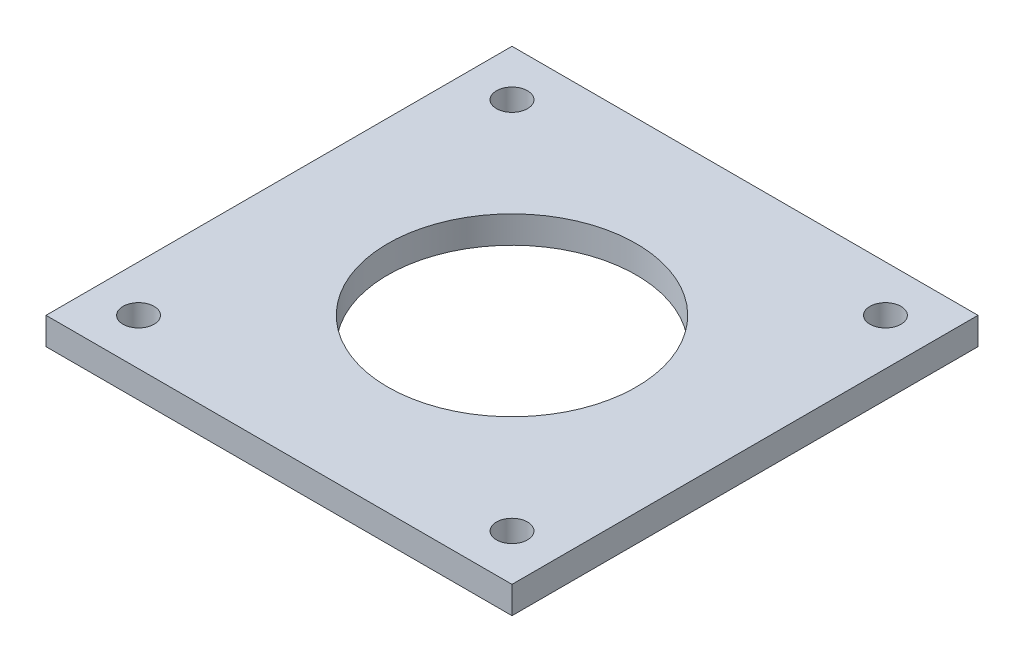
ISO-10303-21;
HEADER;
FILE_DESCRIPTION(('STEP AP214'),'2;1');
FILE_NAME('part.step','',(''),(''),'','','');
FILE_SCHEMA(('AUTOMOTIVE_DESIGN { 1 0 10303 214 1 1 1 1 }'));
ENDSEC;
DATA;
#1=APPLICATION_CONTEXT('core data for automotive mechanical design processes');
#2=APPLICATION_PROTOCOL_DEFINITION('international standard','automotive_design',2000,#1);
#3=PRODUCT_CONTEXT('',#1,'mechanical');
#4=PRODUCT('Part','Part','',(#3));
#5=PRODUCT_RELATED_PRODUCT_CATEGORY('part','',(#4));
#6=PRODUCT_DEFINITION_FORMATION('','',#4);
#7=PRODUCT_DEFINITION_CONTEXT('part definition',#1,'design');
#8=PRODUCT_DEFINITION('design','',#6,#7);
#9=PRODUCT_DEFINITION_SHAPE('','',#8);
#10=(LENGTH_UNIT() NAMED_UNIT(*) SI_UNIT(.MILLI.,.METRE.));
#11=(NAMED_UNIT(*) PLANE_ANGLE_UNIT() SI_UNIT($,.RADIAN.));
#12=(NAMED_UNIT(*) SI_UNIT($,.STERADIAN.) SOLID_ANGLE_UNIT());
#13=UNCERTAINTY_MEASURE_WITH_UNIT(LENGTH_MEASURE(1.E-05),#10,'distance_accuracy_value','');
#14=(GEOMETRIC_REPRESENTATION_CONTEXT(3) GLOBAL_UNCERTAINTY_ASSIGNED_CONTEXT((#13)) GLOBAL_UNIT_ASSIGNED_CONTEXT((#10,
#11,#12)) REPRESENTATION_CONTEXT('',''));
#15=CARTESIAN_POINT('',(0.,0.,0.));
#16=DIRECTION('',(0.,0.,1.));
#17=DIRECTION('',(1.,0.,0.));
#18=AXIS2_PLACEMENT_3D('',#15,#16,#17);
#19=CARTESIAN_POINT('',(0.,3.5,30.));
#20=DIRECTION('',(0.,0.,-1.));
#21=DIRECTION('',(-1.,0.,0.));
#22=AXIS2_PLACEMENT_3D('',#19,#20,#21);
#23=PLANE('',#22);
#24=DIRECTION('',(1.,0.,0.));
#25=VECTOR('',#24,1.);
#26=CARTESIAN_POINT('',(0.,0.,30.));
#27=LINE('',#26,#25);
#28=CARTESIAN_POINT('',(-30.,0.,30.));
#29=VERTEX_POINT('',#28);
#30=CARTESIAN_POINT('',(30.,0.,30.));
#31=VERTEX_POINT('',#30);
#32=EDGE_CURVE('E113',#29,#31,#27,.T.);
#33=ORIENTED_EDGE('',*,*,#32,.T.);
#34=DIRECTION('',(0.,-1.,0.));
#35=VECTOR('',#34,1.);
#36=CARTESIAN_POINT('',(30.,3.5,30.));
#37=LINE('',#36,#35);
#38=CARTESIAN_POINT('',(30.,3.5,30.));
#39=VERTEX_POINT('',#38);
#40=EDGE_CURVE('E11',#39,#31,#37,.T.);
#41=ORIENTED_EDGE('',*,*,#40,.F.);
#42=DIRECTION('',(1.,0.,0.));
#43=VECTOR('',#42,1.);
#44=CARTESIAN_POINT('',(0.,3.5,30.));
#45=LINE('',#44,#43);
#46=CARTESIAN_POINT('',(-30.,3.5,30.));
#47=VERTEX_POINT('',#46);
#48=EDGE_CURVE('E84',#47,#39,#45,.T.);
#49=ORIENTED_EDGE('',*,*,#48,.F.);
#50=DIRECTION('',(0.,-1.,0.));
#51=VECTOR('',#50,1.);
#52=CARTESIAN_POINT('',(-30.,3.5,30.));
#53=LINE('',#52,#51);
#54=EDGE_CURVE('E51',#47,#29,#53,.T.);
#55=ORIENTED_EDGE('',*,*,#54,.T.);
#56=EDGE_LOOP('',(#33,#41,#49,#55));
#57=FACE_BOUND('',#56,.T.);
#58=ADVANCED_FACE('F34',(#57),#23,.F.);
#59=CARTESIAN_POINT('',(30.,3.5,0.));
#60=DIRECTION('',(-1.,0.,0.));
#61=DIRECTION('',(0.,0.,1.));
#62=AXIS2_PLACEMENT_3D('',#59,#60,#61);
#63=PLANE('',#62);
#64=DIRECTION('',(0.,0.,-1.));
#65=VECTOR('',#64,1.);
#66=CARTESIAN_POINT('',(30.,0.,0.));
#67=LINE('',#66,#65);
#68=CARTESIAN_POINT('',(30.,0.,-30.));
#69=VERTEX_POINT('',#68);
#70=EDGE_CURVE('E89',#31,#69,#67,.T.);
#71=ORIENTED_EDGE('',*,*,#70,.T.);
#72=DIRECTION('',(0.,-1.,0.));
#73=VECTOR('',#72,1.);
#74=CARTESIAN_POINT('',(30.,3.5,-30.));
#75=LINE('',#74,#73);
#76=CARTESIAN_POINT('',(30.,3.5,-30.));
#77=VERTEX_POINT('',#76);
#78=EDGE_CURVE('E43',#77,#69,#75,.T.);
#79=ORIENTED_EDGE('',*,*,#78,.F.);
#80=DIRECTION('',(0.,0.,-1.));
#81=VECTOR('',#80,1.);
#82=CARTESIAN_POINT('',(30.,3.5,0.));
#83=LINE('',#82,#81);
#84=EDGE_CURVE('E76',#39,#77,#83,.T.);
#85=ORIENTED_EDGE('',*,*,#84,.F.);
#86=ORIENTED_EDGE('',*,*,#40,.T.);
#87=EDGE_LOOP('',(#71,#79,#85,#86));
#88=FACE_BOUND('',#87,.T.);
#89=ADVANCED_FACE('F88',(#88),#63,.F.);
#90=CARTESIAN_POINT('',(0.,3.5,-30.));
#91=DIRECTION('',(0.,0.,-1.));
#92=DIRECTION('',(-1.,0.,0.));
#93=AXIS2_PLACEMENT_3D('',#90,#91,#92);
#94=PLANE('',#93);
#95=DIRECTION('',(1.,0.,0.));
#96=VECTOR('',#95,1.);
#97=CARTESIAN_POINT('',(0.,0.,-30.));
#98=LINE('',#97,#96);
#99=CARTESIAN_POINT('',(-30.,0.,-30.));
#100=VERTEX_POINT('',#99);
#101=EDGE_CURVE('E116',#100,#69,#98,.T.);
#102=ORIENTED_EDGE('',*,*,#101,.F.);
#103=DIRECTION('',(0.,-1.,0.));
#104=VECTOR('',#103,1.);
#105=CARTESIAN_POINT('',(-30.,3.5,-30.));
#106=LINE('',#105,#104);
#107=CARTESIAN_POINT('',(-30.,3.5,-30.));
#108=VERTEX_POINT('',#107);
#109=EDGE_CURVE('E65',#108,#100,#106,.T.);
#110=ORIENTED_EDGE('',*,*,#109,.F.);
#111=DIRECTION('',(1.,0.,0.));
#112=VECTOR('',#111,1.);
#113=CARTESIAN_POINT('',(0.,3.5,-30.));
#114=LINE('',#113,#112);
#115=EDGE_CURVE('E83',#108,#77,#114,.T.);
#116=ORIENTED_EDGE('',*,*,#115,.T.);
#117=ORIENTED_EDGE('',*,*,#78,.T.);
#118=EDGE_LOOP('',(#102,#110,#116,#117));
#119=FACE_BOUND('',#118,.T.);
#120=ADVANCED_FACE('F92',(#119),#94,.T.);
#121=CARTESIAN_POINT('',(0.,3.5,0.));
#122=DIRECTION('',(0.,-1.,0.));
#123=DIRECTION('',(0.,0.,-1.));
#124=AXIS2_PLACEMENT_3D('',#121,#122,#123);
#125=CYLINDRICAL_SURFACE('',#124,16.);
#126=CARTESIAN_POINT('',(0.,3.5,0.));
#127=DIRECTION('',(0.,1.,0.));
#128=DIRECTION('',(0.,0.,1.));
#129=AXIS2_PLACEMENT_3D('',#126,#127,#128);
#130=CIRCLE('',#129,16.);
#131=CARTESIAN_POINT('',(0.,3.5,16.));
#132=VERTEX_POINT('',#131);
#133=EDGE_CURVE('E138',#132,#132,#130,.T.);
#134=ORIENTED_EDGE('',*,*,#133,.T.);
#135=EDGE_LOOP('',(#134));
#136=FACE_BOUND('',#135,.T.);
#137=CARTESIAN_POINT('',(0.,0.,0.));
#138=DIRECTION('',(0.,1.,0.));
#139=DIRECTION('',(0.,0.,1.));
#140=AXIS2_PLACEMENT_3D('',#137,#138,#139);
#141=CIRCLE('',#140,16.);
#142=CARTESIAN_POINT('',(0.,0.,16.));
#143=VERTEX_POINT('',#142);
#144=EDGE_CURVE('E110',#143,#143,#141,.T.);
#145=ORIENTED_EDGE('',*,*,#144,.F.);
#146=EDGE_LOOP('',(#145));
#147=FACE_BOUND('',#146,.T.);
#148=ADVANCED_FACE('F142',(#136,#147),#125,.F.);
#149=CARTESIAN_POINT('',(24.0416305603426,3.5,24.0416305603426));
#150=DIRECTION('',(0.,-1.,0.));
#151=DIRECTION('',(0.,0.,-1.));
#152=AXIS2_PLACEMENT_3D('',#149,#150,#151);
#153=CYLINDRICAL_SURFACE('',#152,2.);
#154=CARTESIAN_POINT('',(24.0416305603426,3.5,24.0416305603426));
#155=DIRECTION('',(0.,1.,0.));
#156=DIRECTION('',(0.,0.,1.));
#157=AXIS2_PLACEMENT_3D('',#154,#155,#156);
#158=CIRCLE('',#157,2.);
#159=CARTESIAN_POINT('',(24.0416305603426,3.5,26.0416305603426));
#160=VERTEX_POINT('',#159);
#161=EDGE_CURVE('E135',#160,#160,#158,.T.);
#162=ORIENTED_EDGE('',*,*,#161,.T.);
#163=EDGE_LOOP('',(#162));
#164=FACE_BOUND('',#163,.T.);
#165=CARTESIAN_POINT('',(24.0416305603426,0.,24.0416305603426));
#166=DIRECTION('',(0.,1.,0.));
#167=DIRECTION('',(0.,0.,1.));
#168=AXIS2_PLACEMENT_3D('',#165,#166,#167);
#169=CIRCLE('',#168,2.);
#170=CARTESIAN_POINT('',(24.0416305603426,0.,26.0416305603426));
#171=VERTEX_POINT('',#170);
#172=EDGE_CURVE('E107',#171,#171,#169,.T.);
#173=ORIENTED_EDGE('',*,*,#172,.F.);
#174=EDGE_LOOP('',(#173));
#175=FACE_BOUND('',#174,.T.);
#176=ADVANCED_FACE('F168',(#164,#175),#153,.F.);
#177=CARTESIAN_POINT('',(24.0416305603426,3.5,-24.0416305603426));
#178=DIRECTION('',(0.,-1.,0.));
#179=DIRECTION('',(0.,0.,-1.));
#180=AXIS2_PLACEMENT_3D('',#177,#178,#179);
#181=CYLINDRICAL_SURFACE('',#180,2.);
#182=CARTESIAN_POINT('',(24.0416305603426,3.5,-24.0416305603426));
#183=DIRECTION('',(0.,1.,0.));
#184=DIRECTION('',(0.,0.,1.));
#185=AXIS2_PLACEMENT_3D('',#182,#183,#184);
#186=CIRCLE('',#185,2.);
#187=CARTESIAN_POINT('',(24.0416305603426,3.5,-22.0416305603426));
#188=VERTEX_POINT('',#187);
#189=EDGE_CURVE('E130',#188,#188,#186,.T.);
#190=ORIENTED_EDGE('',*,*,#189,.T.);
#191=EDGE_LOOP('',(#190));
#192=FACE_BOUND('',#191,.T.);
#193=CARTESIAN_POINT('',(24.0416305603426,0.,-24.0416305603426));
#194=DIRECTION('',(0.,1.,0.));
#195=DIRECTION('',(0.,0.,1.));
#196=AXIS2_PLACEMENT_3D('',#193,#194,#195);
#197=CIRCLE('',#196,2.);
#198=CARTESIAN_POINT('',(24.0416305603426,0.,-22.0416305603426));
#199=VERTEX_POINT('',#198);
#200=EDGE_CURVE('E104',#199,#199,#197,.T.);
#201=ORIENTED_EDGE('',*,*,#200,.F.);
#202=EDGE_LOOP('',(#201));
#203=FACE_BOUND('',#202,.T.);
#204=ADVANCED_FACE('F171',(#192,#203),#181,.F.);
#205=CARTESIAN_POINT('',(-24.0416305603426,3.5,-24.0416305603426));
#206=DIRECTION('',(0.,-1.,0.));
#207=DIRECTION('',(0.,0.,-1.));
#208=AXIS2_PLACEMENT_3D('',#205,#206,#207);
#209=CYLINDRICAL_SURFACE('',#208,2.);
#210=CARTESIAN_POINT('',(-24.0416305603426,3.5,-24.0416305603426));
#211=DIRECTION('',(0.,1.,0.));
#212=DIRECTION('',(0.,0.,1.));
#213=AXIS2_PLACEMENT_3D('',#210,#211,#212);
#214=CIRCLE('',#213,2.);
#215=CARTESIAN_POINT('',(-24.0416305603426,3.5,-22.0416305603426));
#216=VERTEX_POINT('',#215);
#217=EDGE_CURVE('E125',#216,#216,#214,.T.);
#218=ORIENTED_EDGE('',*,*,#217,.T.);
#219=EDGE_LOOP('',(#218));
#220=FACE_BOUND('',#219,.T.);
#221=CARTESIAN_POINT('',(-24.0416305603426,0.,-24.0416305603426));
#222=DIRECTION('',(0.,1.,0.));
#223=DIRECTION('',(0.,0.,1.));
#224=AXIS2_PLACEMENT_3D('',#221,#222,#223);
#225=CIRCLE('',#224,2.);
#226=CARTESIAN_POINT('',(-24.0416305603426,0.,-22.0416305603426));
#227=VERTEX_POINT('',#226);
#228=EDGE_CURVE('E101',#227,#227,#225,.T.);
#229=ORIENTED_EDGE('',*,*,#228,.F.);
#230=EDGE_LOOP('',(#229));
#231=FACE_BOUND('',#230,.T.);
#232=ADVANCED_FACE('F174',(#220,#231),#209,.F.);
#233=CARTESIAN_POINT('',(-24.0416305603426,3.5,24.0416305603426));
#234=DIRECTION('',(0.,-1.,0.));
#235=DIRECTION('',(0.,0.,-1.));
#236=AXIS2_PLACEMENT_3D('',#233,#234,#235);
#237=CYLINDRICAL_SURFACE('',#236,2.00000000000001);
#238=CARTESIAN_POINT('',(-24.0416305603426,3.5,24.0416305603426));
#239=DIRECTION('',(0.,1.,0.));
#240=DIRECTION('',(0.,0.,1.));
#241=AXIS2_PLACEMENT_3D('',#238,#239,#240);
#242=CIRCLE('',#241,2.00000000000001);
#243=CARTESIAN_POINT('',(-24.0416305603426,3.5,26.0416305603426));
#244=VERTEX_POINT('',#243);
#245=EDGE_CURVE('E121',#244,#244,#242,.T.);
#246=ORIENTED_EDGE('',*,*,#245,.T.);
#247=EDGE_LOOP('',(#246));
#248=FACE_BOUND('',#247,.T.);
#249=CARTESIAN_POINT('',(-24.0416305603426,0.,24.0416305603426));
#250=DIRECTION('',(0.,1.,0.));
#251=DIRECTION('',(0.,0.,1.));
#252=AXIS2_PLACEMENT_3D('',#249,#250,#251);
#253=CIRCLE('',#252,2.00000000000001);
#254=CARTESIAN_POINT('',(-24.0416305603426,0.,26.0416305603426));
#255=VERTEX_POINT('',#254);
#256=EDGE_CURVE('E98',#255,#255,#253,.T.);
#257=ORIENTED_EDGE('',*,*,#256,.F.);
#258=EDGE_LOOP('',(#257));
#259=FACE_BOUND('',#258,.T.);
#260=ADVANCED_FACE('F36',(#248,#259),#237,.F.);
#261=CARTESIAN_POINT('',(-30.,3.5,0.));
#262=DIRECTION('',(-1.,0.,0.));
#263=DIRECTION('',(0.,0.,1.));
#264=AXIS2_PLACEMENT_3D('',#261,#262,#263);
#265=PLANE('',#264);
#266=DIRECTION('',(0.,0.,-1.));
#267=VECTOR('',#266,1.);
#268=CARTESIAN_POINT('',(-30.,0.,0.));
#269=LINE('',#268,#267);
#270=EDGE_CURVE('E118',#29,#100,#269,.T.);
#271=ORIENTED_EDGE('',*,*,#270,.F.);
#272=ORIENTED_EDGE('',*,*,#54,.F.);
#273=DIRECTION('',(0.,0.,-1.));
#274=VECTOR('',#273,1.);
#275=CARTESIAN_POINT('',(-30.,3.5,0.));
#276=LINE('',#275,#274);
#277=EDGE_CURVE('E93',#47,#108,#276,.T.);
#278=ORIENTED_EDGE('',*,*,#277,.T.);
#279=ORIENTED_EDGE('',*,*,#109,.T.);
#280=EDGE_LOOP('',(#271,#272,#278,#279));
#281=FACE_BOUND('',#280,.T.);
#282=ADVANCED_FACE('F147',(#281),#265,.T.);
#283=CARTESIAN_POINT('',(0.,3.5,0.));
#284=DIRECTION('',(0.,1.,0.));
#285=DIRECTION('',(0.,0.,1.));
#286=AXIS2_PLACEMENT_3D('',#283,#284,#285);
#287=PLANE('',#286);
#288=ORIENTED_EDGE('',*,*,#245,.F.);
#289=EDGE_LOOP('',(#288));
#290=FACE_BOUND('',#289,.T.);
#291=ORIENTED_EDGE('',*,*,#217,.F.);
#292=EDGE_LOOP('',(#291));
#293=FACE_BOUND('',#292,.T.);
#294=ORIENTED_EDGE('',*,*,#189,.F.);
#295=EDGE_LOOP('',(#294));
#296=FACE_BOUND('',#295,.T.);
#297=ORIENTED_EDGE('',*,*,#161,.F.);
#298=EDGE_LOOP('',(#297));
#299=FACE_BOUND('',#298,.T.);
#300=ORIENTED_EDGE('',*,*,#133,.F.);
#301=EDGE_LOOP('',(#300));
#302=FACE_BOUND('',#301,.T.);
#303=ORIENTED_EDGE('',*,*,#48,.T.);
#304=ORIENTED_EDGE('',*,*,#84,.T.);
#305=ORIENTED_EDGE('',*,*,#115,.F.);
#306=ORIENTED_EDGE('',*,*,#277,.F.);
#307=EDGE_LOOP('',(#303,#304,#305,#306));
#308=FACE_BOUND('',#307,.T.);
#309=ADVANCED_FACE('F80',(#290,#293,#296,#299,#302,#308),#287,.T.);
#310=CARTESIAN_POINT('',(0.,0.,0.));
#311=DIRECTION('',(0.,1.,0.));
#312=DIRECTION('',(0.,0.,1.));
#313=AXIS2_PLACEMENT_3D('',#310,#311,#312);
#314=PLANE('',#313);
#315=ORIENTED_EDGE('',*,*,#256,.T.);
#316=EDGE_LOOP('',(#315));
#317=FACE_BOUND('',#316,.T.);
#318=ORIENTED_EDGE('',*,*,#228,.T.);
#319=EDGE_LOOP('',(#318));
#320=FACE_BOUND('',#319,.T.);
#321=ORIENTED_EDGE('',*,*,#200,.T.);
#322=EDGE_LOOP('',(#321));
#323=FACE_BOUND('',#322,.T.);
#324=ORIENTED_EDGE('',*,*,#172,.T.);
#325=EDGE_LOOP('',(#324));
#326=FACE_BOUND('',#325,.T.);
#327=ORIENTED_EDGE('',*,*,#144,.T.);
#328=EDGE_LOOP('',(#327));
#329=FACE_BOUND('',#328,.T.);
#330=ORIENTED_EDGE('',*,*,#32,.F.);
#331=ORIENTED_EDGE('',*,*,#270,.T.);
#332=ORIENTED_EDGE('',*,*,#101,.T.);
#333=ORIENTED_EDGE('',*,*,#70,.F.);
#334=EDGE_LOOP('',(#330,#331,#332,#333));
#335=FACE_BOUND('',#334,.T.);
#336=ADVANCED_FACE('F146',(#317,#320,#323,#326,#329,#335),#314,.F.);
#337=CLOSED_SHELL('',(#58,#89,#120,#148,#176,#204,#232,#260,#282,#309,#336));
#338=MANIFOLD_SOLID_BREP('B2',#337);
#339=ADVANCED_BREP_SHAPE_REPRESENTATION('',(#18,#338),#14);
#340=SHAPE_DEFINITION_REPRESENTATION(#9,#339);
ENDSEC;
END-ISO-10303-21;
